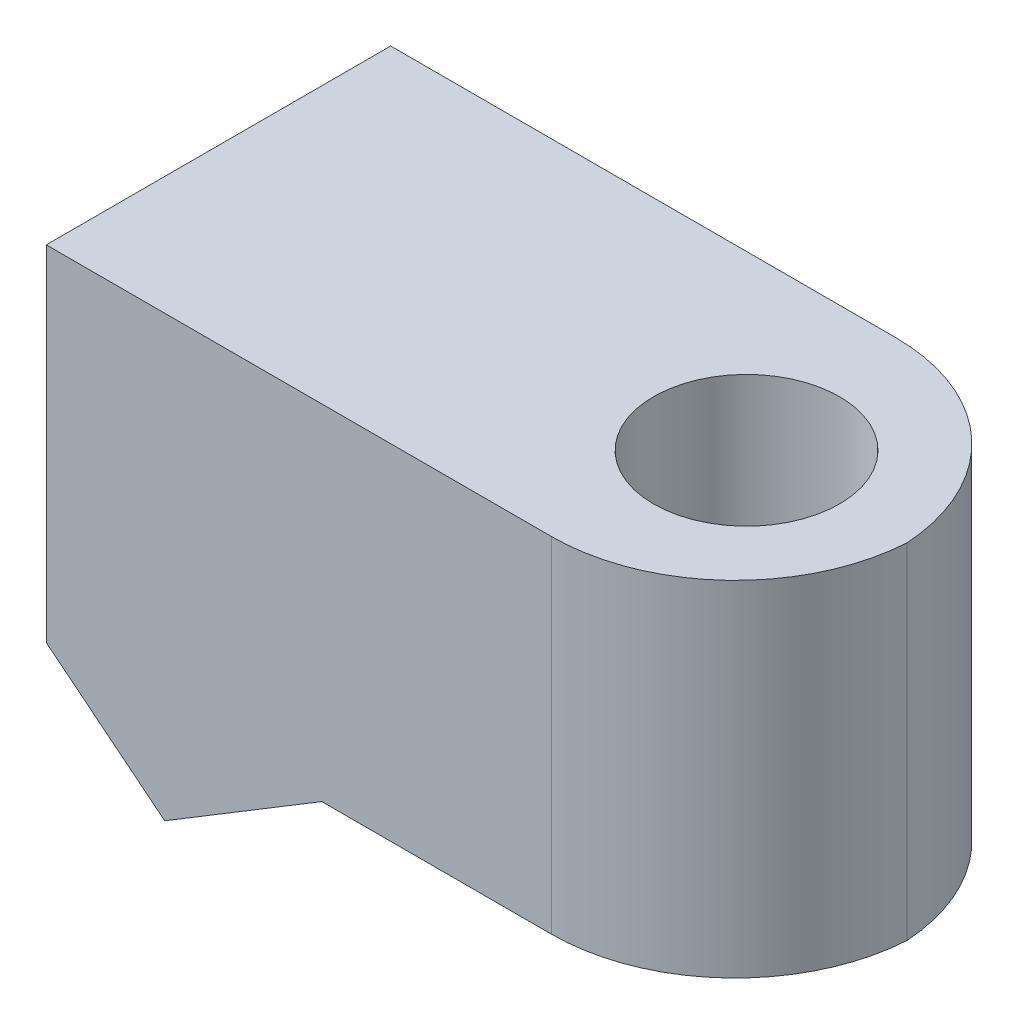
ISO-10303-21;
HEADER;
FILE_DESCRIPTION(('STEP AP214'),'2;1');
FILE_NAME('part.step','',(''),(''),'','','');
FILE_SCHEMA(('AUTOMOTIVE_DESIGN { 1 0 10303 214 1 1 1 1 }'));
ENDSEC;
DATA;
#1=APPLICATION_CONTEXT('core data for automotive mechanical design processes');
#2=APPLICATION_PROTOCOL_DEFINITION('international standard','automotive_design',2000,#1);
#3=PRODUCT_CONTEXT('',#1,'mechanical');
#4=PRODUCT('Part','Part','',(#3));
#5=PRODUCT_RELATED_PRODUCT_CATEGORY('part','',(#4));
#6=PRODUCT_DEFINITION_FORMATION('','',#4);
#7=PRODUCT_DEFINITION_CONTEXT('part definition',#1,'design');
#8=PRODUCT_DEFINITION('design','',#6,#7);
#9=PRODUCT_DEFINITION_SHAPE('','',#8);
#10=(LENGTH_UNIT() NAMED_UNIT(*) SI_UNIT(.MILLI.,.METRE.));
#11=(NAMED_UNIT(*) PLANE_ANGLE_UNIT() SI_UNIT($,.RADIAN.));
#12=(NAMED_UNIT(*) SI_UNIT($,.STERADIAN.) SOLID_ANGLE_UNIT());
#13=UNCERTAINTY_MEASURE_WITH_UNIT(LENGTH_MEASURE(1.E-05),#10,'distance_accuracy_value','');
#14=(GEOMETRIC_REPRESENTATION_CONTEXT(3) GLOBAL_UNCERTAINTY_ASSIGNED_CONTEXT((#13)) GLOBAL_UNIT_ASSIGNED_CONTEXT((#10,
#11,#12)) REPRESENTATION_CONTEXT('',''));
#15=CARTESIAN_POINT('',(0.,0.,0.));
#16=DIRECTION('',(0.,0.,1.));
#17=DIRECTION('',(1.,0.,0.));
#18=AXIS2_PLACEMENT_3D('',#15,#16,#17);
#19=CARTESIAN_POINT('',(0.,0.,0.));
#20=DIRECTION('',(0.,1.,0.));
#21=DIRECTION('',(0.,0.,1.));
#22=AXIS2_PLACEMENT_3D('',#19,#20,#21);
#23=PLANE('',#22);
#24=CARTESIAN_POINT('',(8.,0.,0.));
#25=DIRECTION('',(0.,1.,0.));
#26=DIRECTION('',(0.,0.,1.));
#27=AXIS2_PLACEMENT_3D('',#24,#25,#26);
#28=CIRCLE('',#27,4.05);
#29=CARTESIAN_POINT('',(8.,0.,4.05));
#30=VERTEX_POINT('',#29);
#31=EDGE_CURVE('E181',#30,#30,#28,.T.);
#32=ORIENTED_EDGE('',*,*,#31,.T.);
#33=EDGE_LOOP('',(#32));
#34=FACE_BOUND('',#33,.T.);
#35=DIRECTION('',(0.,0.,1.));
#36=VECTOR('',#35,1.);
#37=CARTESIAN_POINT('',(-2.99999999999999,0.,-20.1958601895664));
#38=LINE('',#37,#36);
#39=CARTESIAN_POINT('',(-2.99999999999999,0.,-7.5));
#40=VERTEX_POINT('',#39);
#41=CARTESIAN_POINT('',(-2.99999999999999,0.,7.5));
#42=VERTEX_POINT('',#41);
#43=EDGE_CURVE('E51',#40,#42,#38,.T.);
#44=ORIENTED_EDGE('',*,*,#43,.F.);
#45=DIRECTION('',(-1.,0.,0.));
#46=VECTOR('',#45,1.);
#47=CARTESIAN_POINT('',(15.,0.,-7.5));
#48=LINE('',#47,#46);
#49=CARTESIAN_POINT('',(7.00000000000001,0.,-7.5));
#50=VERTEX_POINT('',#49);
#51=EDGE_CURVE('E188',#50,#40,#48,.T.);
#52=ORIENTED_EDGE('',*,*,#51,.F.);
#53=CARTESIAN_POINT('',(7.00000000000001,0.,0.5));
#54=DIRECTION('',(0.,1.,0.));
#55=DIRECTION('',(0.,0.,1.));
#56=AXIS2_PLACEMENT_3D('',#53,#54,#55);
#57=CIRCLE('',#56,8.);
#58=CARTESIAN_POINT('',(14.9843597113357,0.,0.));
#59=VERTEX_POINT('',#58);
#60=EDGE_CURVE('E206',#50,#59,#57,.F.);
#61=ORIENTED_EDGE('',*,*,#60,.T.);
#62=CARTESIAN_POINT('',(7.00000000000001,0.,-0.5));
#63=DIRECTION('',(0.,1.,0.));
#64=DIRECTION('',(0.,0.,1.));
#65=AXIS2_PLACEMENT_3D('',#62,#63,#64);
#66=CIRCLE('',#65,8.);
#67=CARTESIAN_POINT('',(7.00000000000001,0.,7.5));
#68=VERTEX_POINT('',#67);
#69=EDGE_CURVE('E203',#59,#68,#66,.F.);
#70=ORIENTED_EDGE('',*,*,#69,.T.);
#71=DIRECTION('',(1.,0.,0.));
#72=VECTOR('',#71,1.);
#73=CARTESIAN_POINT('',(15.,0.,7.5));
#74=LINE('',#73,#72);
#75=EDGE_CURVE('E195',#42,#68,#74,.T.);
#76=ORIENTED_EDGE('',*,*,#75,.F.);
#77=EDGE_LOOP('',(#44,#52,#61,#70,#76));
#78=FACE_BOUND('',#77,.T.);
#79=ADVANCED_FACE('F35',(#34,#78),#23,.F.);
#80=CARTESIAN_POINT('',(0.,15.,0.));
#81=DIRECTION('',(0.,1.,0.));
#82=DIRECTION('',(0.,0.,1.));
#83=AXIS2_PLACEMENT_3D('',#80,#81,#82);
#84=PLANE('',#83);
#85=CARTESIAN_POINT('',(7.00000000000001,15.,-0.5));
#86=DIRECTION('',(0.,1.,0.));
#87=DIRECTION('',(0.,0.,1.));
#88=AXIS2_PLACEMENT_3D('',#85,#86,#87);
#89=CIRCLE('',#88,8.);
#90=CARTESIAN_POINT('',(7.00000000000001,15.,7.5));
#91=VERTEX_POINT('',#90);
#92=CARTESIAN_POINT('',(14.9843597113357,15.,0.));
#93=VERTEX_POINT('',#92);
#94=EDGE_CURVE('E208',#91,#93,#89,.T.);
#95=ORIENTED_EDGE('',*,*,#94,.T.);
#96=CARTESIAN_POINT('',(7.00000000000001,15.,0.5));
#97=DIRECTION('',(0.,1.,0.));
#98=DIRECTION('',(0.,0.,1.));
#99=AXIS2_PLACEMENT_3D('',#96,#97,#98);
#100=CIRCLE('',#99,8.);
#101=CARTESIAN_POINT('',(7.00000000000001,15.,-7.5));
#102=VERTEX_POINT('',#101);
#103=EDGE_CURVE('E44',#93,#102,#100,.T.);
#104=ORIENTED_EDGE('',*,*,#103,.T.);
#105=DIRECTION('',(-1.,0.,0.));
#106=VECTOR('',#105,1.);
#107=CARTESIAN_POINT('',(15.,15.,-7.5));
#108=LINE('',#107,#106);
#109=CARTESIAN_POINT('',(-15.,15.,-7.5));
#110=VERTEX_POINT('',#109);
#111=EDGE_CURVE('E191',#102,#110,#108,.T.);
#112=ORIENTED_EDGE('',*,*,#111,.T.);
#113=DIRECTION('',(0.,0.,1.));
#114=VECTOR('',#113,1.);
#115=CARTESIAN_POINT('',(-15.,15.,7.5));
#116=LINE('',#115,#114);
#117=CARTESIAN_POINT('',(-15.,15.,7.5));
#118=VERTEX_POINT('',#117);
#119=EDGE_CURVE('E184',#110,#118,#116,.T.);
#120=ORIENTED_EDGE('',*,*,#119,.T.);
#121=DIRECTION('',(1.,0.,0.));
#122=VECTOR('',#121,1.);
#123=CARTESIAN_POINT('',(15.,15.,7.5));
#124=LINE('',#123,#122);
#125=EDGE_CURVE('E187',#118,#91,#124,.T.);
#126=ORIENTED_EDGE('',*,*,#125,.T.);
#127=EDGE_LOOP('',(#95,#104,#112,#120,#126));
#128=FACE_BOUND('',#127,.T.);
#129=CARTESIAN_POINT('',(8.,15.,0.));
#130=DIRECTION('',(0.,1.,0.));
#131=DIRECTION('',(0.,0.,1.));
#132=AXIS2_PLACEMENT_3D('',#129,#130,#131);
#133=CIRCLE('',#132,4.05);
#134=CARTESIAN_POINT('',(8.,15.,4.05));
#135=VERTEX_POINT('',#134);
#136=EDGE_CURVE('E177',#135,#135,#133,.T.);
#137=ORIENTED_EDGE('',*,*,#136,.F.);
#138=EDGE_LOOP('',(#137));
#139=FACE_BOUND('',#138,.T.);
#140=ADVANCED_FACE('F213',(#128,#139),#84,.T.);
#141=CARTESIAN_POINT('',(-15.,15.,7.5));
#142=DIRECTION('',(1.,0.,0.));
#143=DIRECTION('',(0.,0.,-1.));
#144=AXIS2_PLACEMENT_3D('',#141,#142,#143);
#145=PLANE('',#144);
#146=DIRECTION('',(0.,0.,1.));
#147=VECTOR('',#146,1.);
#148=CARTESIAN_POINT('',(-15.,2.45,5.05));
#149=LINE('',#148,#147);
#150=CARTESIAN_POINT('',(-15.,2.45,-5.05));
#151=VERTEX_POINT('',#150);
#152=CARTESIAN_POINT('',(-15.,2.45,5.05));
#153=VERTEX_POINT('',#152);
#154=EDGE_CURVE('E162',#151,#153,#149,.T.);
#155=ORIENTED_EDGE('',*,*,#154,.F.);
#156=DIRECTION('',(0.,-1.,0.));
#157=VECTOR('',#156,1.);
#158=CARTESIAN_POINT('',(-15.,2.45,-5.05));
#159=LINE('',#158,#157);
#160=CARTESIAN_POINT('',(-15.,12.55,-5.05));
#161=VERTEX_POINT('',#160);
#162=EDGE_CURVE('E59',#161,#151,#159,.T.);
#163=ORIENTED_EDGE('',*,*,#162,.F.);
#164=DIRECTION('',(0.,0.,-1.));
#165=VECTOR('',#164,1.);
#166=CARTESIAN_POINT('',(-15.,12.55,5.05));
#167=LINE('',#166,#165);
#168=CARTESIAN_POINT('',(-15.,12.55,5.05));
#169=VERTEX_POINT('',#168);
#170=EDGE_CURVE('E151',#169,#161,#167,.T.);
#171=ORIENTED_EDGE('',*,*,#170,.F.);
#172=DIRECTION('',(0.,1.,0.));
#173=VECTOR('',#172,1.);
#174=CARTESIAN_POINT('',(-15.,2.45,5.05));
#175=LINE('',#174,#173);
#176=EDGE_CURVE('E165',#153,#169,#175,.T.);
#177=ORIENTED_EDGE('',*,*,#176,.F.);
#178=EDGE_LOOP('',(#155,#163,#171,#177));
#179=FACE_BOUND('',#178,.T.);
#180=DIRECTION('',(0.,0.,1.));
#181=VECTOR('',#180,1.);
#182=CARTESIAN_POINT('',(-15.,0.,7.5));
#183=LINE('',#182,#181);
#184=CARTESIAN_POINT('',(-15.,0.,-7.5));
#185=VERTEX_POINT('',#184);
#186=CARTESIAN_POINT('',(-15.,0.,7.5));
#187=VERTEX_POINT('',#186);
#188=EDGE_CURVE('E180',#185,#187,#183,.T.);
#189=ORIENTED_EDGE('',*,*,#188,.T.);
#190=DIRECTION('',(0.,-1.,0.));
#191=VECTOR('',#190,1.);
#192=CARTESIAN_POINT('',(-15.,15.,7.5));
#193=LINE('',#192,#191);
#194=EDGE_CURVE('E136',#118,#187,#193,.T.);
#195=ORIENTED_EDGE('',*,*,#194,.F.);
#196=ORIENTED_EDGE('',*,*,#119,.F.);
#197=DIRECTION('',(0.,-1.,0.));
#198=VECTOR('',#197,1.);
#199=CARTESIAN_POINT('',(-15.,15.,-7.5));
#200=LINE('',#199,#198);
#201=EDGE_CURVE('E193',#110,#185,#200,.T.);
#202=ORIENTED_EDGE('',*,*,#201,.T.);
#203=EDGE_LOOP('',(#189,#195,#196,#202));
#204=FACE_BOUND('',#203,.T.);
#205=ADVANCED_FACE('F229',(#179,#204),#145,.F.);
#206=CARTESIAN_POINT('',(15.,15.,7.5));
#207=DIRECTION('',(0.,0.,-1.));
#208=DIRECTION('',(-1.,0.,0.));
#209=AXIS2_PLACEMENT_3D('',#206,#207,#208);
#210=PLANE('',#209);
#211=ORIENTED_EDGE('',*,*,#194,.T.);
#212=DIRECTION('',(0.779452166144205,-0.626461747190606,0.));
#213=VECTOR('',#212,1.);
#214=CARTESIAN_POINT('',(-9.84215858095841,-4.14546329775299,7.5));
#215=LINE('',#214,#213);
#216=CARTESIAN_POINT('',(-9.84215858095841,-4.14546329775299,7.5));
#217=VERTEX_POINT('',#216);
#218=EDGE_CURVE('E124',#187,#217,#215,.T.);
#219=ORIENTED_EDGE('',*,*,#218,.T.);
#220=DIRECTION('',(0.855269822619803,0.518182912219123,0.));
#221=VECTOR('',#220,1.);
#222=CARTESIAN_POINT('',(-2.99999999999999,0.,7.5));
#223=LINE('',#222,#221);
#224=EDGE_CURVE('E130',#217,#42,#223,.T.);
#225=ORIENTED_EDGE('',*,*,#224,.T.);
#226=ORIENTED_EDGE('',*,*,#75,.T.);
#227=DIRECTION('',(0.,-1.,0.));
#228=VECTOR('',#227,1.);
#229=CARTESIAN_POINT('',(7.00000000000001,15.,7.5));
#230=LINE('',#229,#228);
#231=EDGE_CURVE('E11',#68,#91,#230,.F.);
#232=ORIENTED_EDGE('',*,*,#231,.T.);
#233=ORIENTED_EDGE('',*,*,#125,.F.);
#234=EDGE_LOOP('',(#211,#219,#225,#226,#232,#233));
#235=FACE_BOUND('',#234,.T.);
#236=ADVANCED_FACE('F134',(#235),#210,.F.);
#237=CARTESIAN_POINT('',(15.,15.,-7.5));
#238=DIRECTION('',(0.,0.,1.));
#239=DIRECTION('',(1.,0.,0.));
#240=AXIS2_PLACEMENT_3D('',#237,#238,#239);
#241=PLANE('',#240);
#242=ORIENTED_EDGE('',*,*,#111,.F.);
#243=DIRECTION('',(0.,-1.,0.));
#244=VECTOR('',#243,1.);
#245=CARTESIAN_POINT('',(7.00000000000001,15.,-7.5));
#246=LINE('',#245,#244);
#247=EDGE_CURVE('E200',#102,#50,#246,.T.);
#248=ORIENTED_EDGE('',*,*,#247,.T.);
#249=ORIENTED_EDGE('',*,*,#51,.T.);
#250=DIRECTION('',(-0.855269822619803,-0.518182912219123,0.));
#251=VECTOR('',#250,1.);
#252=CARTESIAN_POINT('',(-2.99999999999999,0.,-7.5));
#253=LINE('',#252,#251);
#254=CARTESIAN_POINT('',(-9.84215858095841,-4.14546329775299,-7.5));
#255=VERTEX_POINT('',#254);
#256=EDGE_CURVE('E144',#40,#255,#253,.T.);
#257=ORIENTED_EDGE('',*,*,#256,.T.);
#258=DIRECTION('',(-0.779452166144205,0.626461747190606,0.));
#259=VECTOR('',#258,1.);
#260=CARTESIAN_POINT('',(-9.84215858095841,-4.14546329775299,-7.5));
#261=LINE('',#260,#259);
#262=EDGE_CURVE('E126',#255,#185,#261,.T.);
#263=ORIENTED_EDGE('',*,*,#262,.T.);
#264=ORIENTED_EDGE('',*,*,#201,.F.);
#265=EDGE_LOOP('',(#242,#248,#249,#257,#263,#264));
#266=FACE_BOUND('',#265,.T.);
#267=ADVANCED_FACE('F222',(#266),#241,.F.);
#268=CARTESIAN_POINT('',(8.,15.,0.));
#269=DIRECTION('',(0.,-1.,0.));
#270=DIRECTION('',(0.,0.,-1.));
#271=AXIS2_PLACEMENT_3D('',#268,#269,#270);
#272=CYLINDRICAL_SURFACE('',#271,4.05);
#273=ORIENTED_EDGE('',*,*,#136,.T.);
#274=EDGE_LOOP('',(#273));
#275=FACE_BOUND('',#274,.T.);
#276=ORIENTED_EDGE('',*,*,#31,.F.);
#277=EDGE_LOOP('',(#276));
#278=FACE_BOUND('',#277,.T.);
#279=ADVANCED_FACE('F262',(#275,#278),#272,.F.);
#280=CARTESIAN_POINT('',(7.00000000000001,15.,-0.5));
#281=DIRECTION('',(0.,-1.,0.));
#282=DIRECTION('',(0.,0.,-1.));
#283=AXIS2_PLACEMENT_3D('',#280,#281,#282);
#284=CYLINDRICAL_SURFACE('',#283,8.);
#285=DIRECTION('',(0.,-1.,0.));
#286=VECTOR('',#285,1.);
#287=CARTESIAN_POINT('',(14.9843597113357,7.5,0.));
#288=LINE('',#287,#286);
#289=EDGE_CURVE('E39',#93,#59,#288,.T.);
#290=ORIENTED_EDGE('',*,*,#289,.F.);
#291=ORIENTED_EDGE('',*,*,#94,.F.);
#292=ORIENTED_EDGE('',*,*,#231,.F.);
#293=ORIENTED_EDGE('',*,*,#69,.F.);
#294=EDGE_LOOP('',(#290,#291,#292,#293));
#295=FACE_BOUND('',#294,.T.);
#296=ADVANCED_FACE('F37',(#295),#284,.T.);
#297=CARTESIAN_POINT('',(7.00000000000001,15.,0.5));
#298=DIRECTION('',(0.,-1.,0.));
#299=DIRECTION('',(0.,0.,-1.));
#300=AXIS2_PLACEMENT_3D('',#297,#298,#299);
#301=CYLINDRICAL_SURFACE('',#300,8.);
#302=ORIENTED_EDGE('',*,*,#103,.F.);
#303=ORIENTED_EDGE('',*,*,#289,.T.);
#304=ORIENTED_EDGE('',*,*,#60,.F.);
#305=ORIENTED_EDGE('',*,*,#247,.F.);
#306=EDGE_LOOP('',(#302,#303,#304,#305));
#307=FACE_BOUND('',#306,.T.);
#308=ADVANCED_FACE('F224',(#307),#301,.T.);
#309=CARTESIAN_POINT('',(2.00000000000001,2.45,-5.05));
#310=DIRECTION('',(0.,0.,-1.));
#311=DIRECTION('',(-1.,0.,0.));
#312=AXIS2_PLACEMENT_3D('',#309,#310,#311);
#313=PLANE('',#312);
#314=ORIENTED_EDGE('',*,*,#162,.T.);
#315=DIRECTION('',(-1.,0.,0.));
#316=VECTOR('',#315,1.);
#317=CARTESIAN_POINT('',(2.00000000000001,2.45,-5.05));
#318=LINE('',#317,#316);
#319=CARTESIAN_POINT('',(2.00000000000001,2.45,-5.05));
#320=VERTEX_POINT('',#319);
#321=EDGE_CURVE('E160',#320,#151,#318,.T.);
#322=ORIENTED_EDGE('',*,*,#321,.F.);
#323=DIRECTION('',(0.,-1.,0.));
#324=VECTOR('',#323,1.);
#325=CARTESIAN_POINT('',(2.00000000000001,2.45,-5.05));
#326=LINE('',#325,#324);
#327=CARTESIAN_POINT('',(2.00000000000001,12.55,-5.05));
#328=VERTEX_POINT('',#327);
#329=EDGE_CURVE('E147',#328,#320,#326,.T.);
#330=ORIENTED_EDGE('',*,*,#329,.F.);
#331=DIRECTION('',(-1.,0.,0.));
#332=VECTOR('',#331,1.);
#333=CARTESIAN_POINT('',(2.00000000000001,12.55,-5.05));
#334=LINE('',#333,#332);
#335=EDGE_CURVE('E170',#328,#161,#334,.T.);
#336=ORIENTED_EDGE('',*,*,#335,.T.);
#337=EDGE_LOOP('',(#314,#322,#330,#336));
#338=FACE_BOUND('',#337,.T.);
#339=ADVANCED_FACE('F268',(#338),#313,.F.);
#340=CARTESIAN_POINT('',(2.00000000000001,12.55,5.05));
#341=DIRECTION('',(0.,1.,0.));
#342=DIRECTION('',(0.,0.,1.));
#343=AXIS2_PLACEMENT_3D('',#340,#341,#342);
#344=PLANE('',#343);
#345=ORIENTED_EDGE('',*,*,#170,.T.);
#346=ORIENTED_EDGE('',*,*,#335,.F.);
#347=DIRECTION('',(0.,0.,-1.));
#348=VECTOR('',#347,1.);
#349=CARTESIAN_POINT('',(2.00000000000001,12.55,5.05));
#350=LINE('',#349,#348);
#351=CARTESIAN_POINT('',(2.00000000000001,12.55,5.05));
#352=VERTEX_POINT('',#351);
#353=EDGE_CURVE('E157',#352,#328,#350,.T.);
#354=ORIENTED_EDGE('',*,*,#353,.F.);
#355=DIRECTION('',(-1.,0.,0.));
#356=VECTOR('',#355,1.);
#357=CARTESIAN_POINT('',(2.00000000000001,12.55,5.05));
#358=LINE('',#357,#356);
#359=EDGE_CURVE('E172',#352,#169,#358,.T.);
#360=ORIENTED_EDGE('',*,*,#359,.T.);
#361=EDGE_LOOP('',(#345,#346,#354,#360));
#362=FACE_BOUND('',#361,.T.);
#363=ADVANCED_FACE('F273',(#362),#344,.F.);
#364=CARTESIAN_POINT('',(2.00000000000001,2.45,5.05));
#365=DIRECTION('',(0.,0.,1.));
#366=DIRECTION('',(1.,0.,0.));
#367=AXIS2_PLACEMENT_3D('',#364,#365,#366);
#368=PLANE('',#367);
#369=ORIENTED_EDGE('',*,*,#176,.T.);
#370=ORIENTED_EDGE('',*,*,#359,.F.);
#371=DIRECTION('',(0.,1.,0.));
#372=VECTOR('',#371,1.);
#373=CARTESIAN_POINT('',(2.00000000000001,2.45,5.05));
#374=LINE('',#373,#372);
#375=CARTESIAN_POINT('',(2.00000000000001,2.45,5.05));
#376=VERTEX_POINT('',#375);
#377=EDGE_CURVE('E154',#376,#352,#374,.T.);
#378=ORIENTED_EDGE('',*,*,#377,.F.);
#379=DIRECTION('',(-1.,0.,0.));
#380=VECTOR('',#379,1.);
#381=CARTESIAN_POINT('',(2.00000000000001,2.45,5.05));
#382=LINE('',#381,#380);
#383=EDGE_CURVE('E174',#376,#153,#382,.T.);
#384=ORIENTED_EDGE('',*,*,#383,.T.);
#385=EDGE_LOOP('',(#369,#370,#378,#384));
#386=FACE_BOUND('',#385,.T.);
#387=ADVANCED_FACE('F285',(#386),#368,.F.);
#388=CARTESIAN_POINT('',(2.00000000000001,2.45,5.05));
#389=DIRECTION('',(0.,-1.,0.));
#390=DIRECTION('',(0.,0.,-1.));
#391=AXIS2_PLACEMENT_3D('',#388,#389,#390);
#392=PLANE('',#391);
#393=CARTESIAN_POINT('',(-9.16126980698973,2.45,0.));
#394=DIRECTION('',(0.,-1.,0.));
#395=DIRECTION('',(1.,0.,0.));
#396=AXIS2_PLACEMENT_3D('',#393,#394,#395);
#397=ELLIPSE('',#396,3.74150930544701,3.2);
#398=CARTESIAN_POINT('',(-5.41976050154272,2.45,0.));
#399=VERTEX_POINT('',#398);
#400=EDGE_CURVE('E138',#399,#399,#397,.F.);
#401=ORIENTED_EDGE('',*,*,#400,.F.);
#402=EDGE_LOOP('',(#401));
#403=FACE_BOUND('',#402,.T.);
#404=ORIENTED_EDGE('',*,*,#154,.T.);
#405=ORIENTED_EDGE('',*,*,#383,.F.);
#406=DIRECTION('',(0.,0.,1.));
#407=VECTOR('',#406,1.);
#408=CARTESIAN_POINT('',(2.00000000000001,2.45,5.05));
#409=LINE('',#408,#407);
#410=EDGE_CURVE('E150',#320,#376,#409,.T.);
#411=ORIENTED_EDGE('',*,*,#410,.F.);
#412=ORIENTED_EDGE('',*,*,#321,.T.);
#413=EDGE_LOOP('',(#404,#405,#411,#412));
#414=FACE_BOUND('',#413,.T.);
#415=ADVANCED_FACE('F247',(#403,#414),#392,.F.);
#416=CARTESIAN_POINT('',(2.00000000000001,0.,0.));
#417=DIRECTION('',(-1.,0.,0.));
#418=DIRECTION('',(0.,0.,1.));
#419=AXIS2_PLACEMENT_3D('',#416,#417,#418);
#420=PLANE('',#419);
#421=ORIENTED_EDGE('',*,*,#329,.T.);
#422=ORIENTED_EDGE('',*,*,#410,.T.);
#423=ORIENTED_EDGE('',*,*,#377,.T.);
#424=ORIENTED_EDGE('',*,*,#353,.T.);
#425=EDGE_LOOP('',(#421,#422,#423,#424));
#426=FACE_BOUND('',#425,.T.);
#427=ADVANCED_FACE('F240',(#426),#420,.T.);
#428=CARTESIAN_POINT('',(-2.99999999999999,0.,-20.1958601895664));
#429=DIRECTION('',(0.518182912219123,-0.855269822619802,0.));
#430=DIRECTION('',(0.855269822619803,0.518182912219123,0.));
#431=AXIS2_PLACEMENT_3D('',#428,#429,#430);
#432=PLANE('',#431);
#433=CARTESIAN_POINT('',(-6.4210792904792,-2.07273164887649,0.));
#434=DIRECTION('',(0.518182912219123,-0.855269822619803,0.));
#435=DIRECTION('',(0.855269822619803,0.518182912219123,0.));
#436=AXIS2_PLACEMENT_3D('',#433,#434,#435);
#437=CIRCLE('',#436,3.2);
#438=CARTESIAN_POINT('',(-3.68421585809584,-0.414546329775298,0.));
#439=VERTEX_POINT('',#438);
#440=EDGE_CURVE('E233',#439,#439,#437,.T.);
#441=ORIENTED_EDGE('',*,*,#440,.F.);
#442=EDGE_LOOP('',(#441));
#443=FACE_BOUND('',#442,.T.);
#444=ORIENTED_EDGE('',*,*,#256,.F.);
#445=ORIENTED_EDGE('',*,*,#43,.T.);
#446=ORIENTED_EDGE('',*,*,#224,.F.);
#447=DIRECTION('',(0.,0.,1.));
#448=VECTOR('',#447,1.);
#449=CARTESIAN_POINT('',(-9.84215858095841,-4.14546329775299,-20.1958601895664));
#450=LINE('',#449,#448);
#451=EDGE_CURVE('E120',#255,#217,#450,.T.);
#452=ORIENTED_EDGE('',*,*,#451,.F.);
#453=EDGE_LOOP('',(#444,#445,#446,#452));
#454=FACE_BOUND('',#453,.T.);
#455=ADVANCED_FACE('F140',(#443,#454),#432,.T.);
#456=CARTESIAN_POINT('',(-9.84215858095841,-4.14546329775299,-20.1958601895664));
#457=DIRECTION('',(-0.626461747190606,-0.779452166144205,0.));
#458=DIRECTION('',(0.779452166144205,-0.626461747190606,0.));
#459=AXIS2_PLACEMENT_3D('',#456,#457,#458);
#460=PLANE('',#459);
#461=ORIENTED_EDGE('',*,*,#262,.F.);
#462=ORIENTED_EDGE('',*,*,#451,.T.);
#463=ORIENTED_EDGE('',*,*,#218,.F.);
#464=ORIENTED_EDGE('',*,*,#188,.F.);
#465=EDGE_LOOP('',(#461,#462,#463,#464));
#466=FACE_BOUND('',#465,.T.);
#467=ADVANCED_FACE('F122',(#466),#460,.T.);
#468=CARTESIAN_POINT('',(-14.2481556957898,10.8459927840334,0.));
#469=DIRECTION('',(0.518182912219123,-0.855269822619802,0.));
#470=DIRECTION('',(0.855269822619803,0.518182912219123,0.));
#471=AXIS2_PLACEMENT_3D('',#468,#469,#470);
#472=CYLINDRICAL_SURFACE('',#471,3.2);
#473=ORIENTED_EDGE('',*,*,#400,.T.);
#474=EDGE_LOOP('',(#473));
#475=FACE_BOUND('',#474,.T.);
#476=ORIENTED_EDGE('',*,*,#440,.T.);
#477=EDGE_LOOP('',(#476));
#478=FACE_BOUND('',#477,.T.);
#479=ADVANCED_FACE('F237',(#475,#478),#472,.F.);
#480=CLOSED_SHELL('',(#79,#140,#205,#236,#267,#279,#296,#308,#339,#363,#387,#415,#427,#455,#467,#479));
#481=MANIFOLD_SOLID_BREP('B2',#480);
#482=ADVANCED_BREP_SHAPE_REPRESENTATION('',(#18,#481),#14);
#483=SHAPE_DEFINITION_REPRESENTATION(#9,#482);
ENDSEC;
END-ISO-10303-21;
